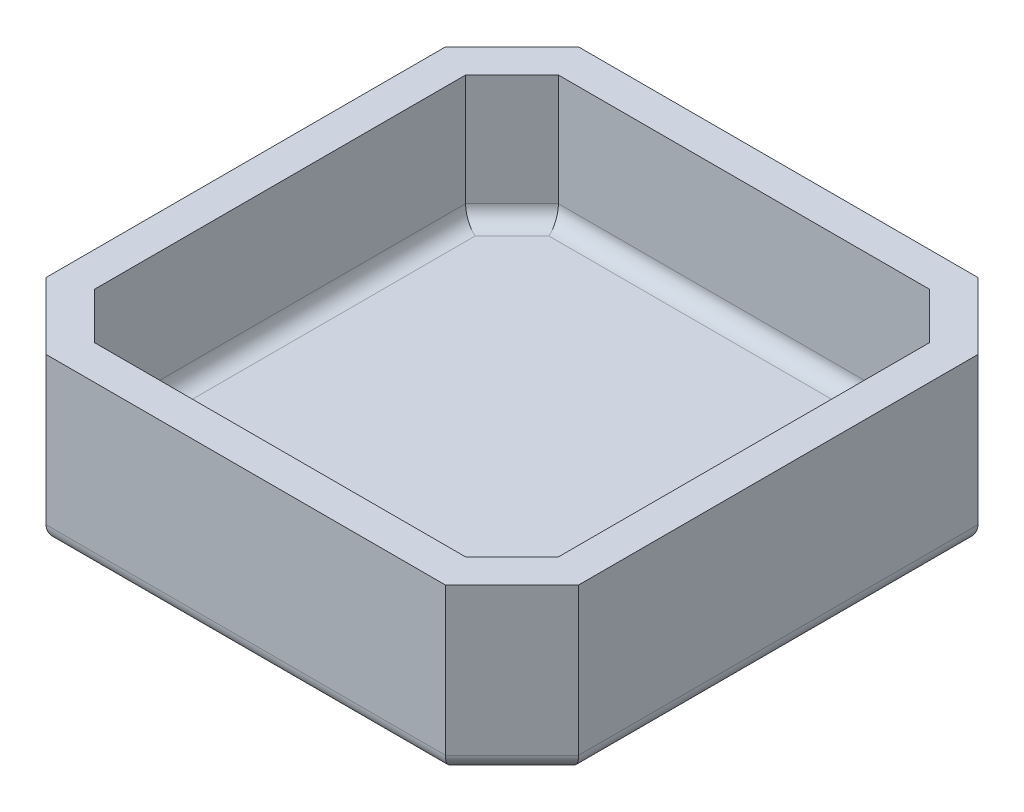
ISO-10303-21;
HEADER;
FILE_DESCRIPTION(('STEP AP214'),'2;1');
FILE_NAME('part.step','',(''),(''),'','','');
FILE_SCHEMA(('AUTOMOTIVE_DESIGN { 1 0 10303 214 1 1 1 1 }'));
ENDSEC;
DATA;
#1=APPLICATION_CONTEXT('core data for automotive mechanical design processes');
#2=APPLICATION_PROTOCOL_DEFINITION('international standard','automotive_design',2000,#1);
#3=PRODUCT_CONTEXT('',#1,'mechanical');
#4=PRODUCT('Part','Part','',(#3));
#5=PRODUCT_RELATED_PRODUCT_CATEGORY('part','',(#4));
#6=PRODUCT_DEFINITION_FORMATION('','',#4);
#7=PRODUCT_DEFINITION_CONTEXT('part definition',#1,'design');
#8=PRODUCT_DEFINITION('design','',#6,#7);
#9=PRODUCT_DEFINITION_SHAPE('','',#8);
#10=(LENGTH_UNIT() NAMED_UNIT(*) SI_UNIT(.MILLI.,.METRE.));
#11=(NAMED_UNIT(*) PLANE_ANGLE_UNIT() SI_UNIT($,.RADIAN.));
#12=(NAMED_UNIT(*) SI_UNIT($,.STERADIAN.) SOLID_ANGLE_UNIT());
#13=UNCERTAINTY_MEASURE_WITH_UNIT(LENGTH_MEASURE(1.E-05),#10,'distance_accuracy_value','');
#14=(GEOMETRIC_REPRESENTATION_CONTEXT(3) GLOBAL_UNCERTAINTY_ASSIGNED_CONTEXT((#13)) GLOBAL_UNIT_ASSIGNED_CONTEXT((#10,
#11,#12)) REPRESENTATION_CONTEXT('',''));
#15=CARTESIAN_POINT('',(0.,0.,0.));
#16=DIRECTION('',(0.,0.,1.));
#17=DIRECTION('',(1.,0.,0.));
#18=AXIS2_PLACEMENT_3D('',#15,#16,#17);
#19=CARTESIAN_POINT('',(32.5,4.4,32.5));
#20=DIRECTION('',(-1.,0.,0.));
#21=DIRECTION('',(0.,0.,1.));
#22=AXIS2_PLACEMENT_3D('',#19,#20,#21);
#23=PLANE('',#22);
#24=DIRECTION('',(0.,-1.,0.));
#25=VECTOR('',#24,1.);
#26=CARTESIAN_POINT('',(32.5,4.4,24.375));
#27=LINE('',#26,#25);
#28=CARTESIAN_POINT('',(32.5,20.,24.375));
#29=VERTEX_POINT('',#28);
#30=CARTESIAN_POINT('',(32.5,2.,24.375));
#31=VERTEX_POINT('',#30);
#32=EDGE_CURVE('E292',#29,#31,#27,.T.);
#33=ORIENTED_EDGE('',*,*,#32,.T.);
#34=DIRECTION('',(0.,0.,-1.));
#35=VECTOR('',#34,1.);
#36=CARTESIAN_POINT('',(32.5,2.,-24.375));
#37=LINE('',#36,#35);
#38=CARTESIAN_POINT('',(32.5,2.,-24.375));
#39=VERTEX_POINT('',#38);
#40=EDGE_CURVE('E360',#31,#39,#37,.T.);
#41=ORIENTED_EDGE('',*,*,#40,.T.);
#42=DIRECTION('',(0.,1.,0.));
#43=VECTOR('',#42,1.);
#44=CARTESIAN_POINT('',(32.5,4.4,-24.375));
#45=LINE('',#44,#43);
#46=CARTESIAN_POINT('',(32.5,20.,-24.375));
#47=VERTEX_POINT('',#46);
#48=EDGE_CURVE('E295',#39,#47,#45,.T.);
#49=ORIENTED_EDGE('',*,*,#48,.T.);
#50=DIRECTION('',(0.,0.,-1.));
#51=VECTOR('',#50,1.);
#52=CARTESIAN_POINT('',(32.5,20.,0.));
#53=LINE('',#52,#51);
#54=EDGE_CURVE('E263',#29,#47,#53,.T.);
#55=ORIENTED_EDGE('',*,*,#54,.F.);
#56=EDGE_LOOP('',(#33,#41,#49,#55));
#57=FACE_BOUND('',#56,.T.);
#58=ADVANCED_FACE('F35',(#57),#23,.F.);
#59=CARTESIAN_POINT('',(-32.5,4.4,-32.5));
#60=DIRECTION('',(0.,0.,1.));
#61=DIRECTION('',(1.,0.,0.));
#62=AXIS2_PLACEMENT_3D('',#59,#60,#61);
#63=PLANE('',#62);
#64=DIRECTION('',(0.,-1.,0.));
#65=VECTOR('',#64,1.);
#66=CARTESIAN_POINT('',(24.375,4.4,-32.5));
#67=LINE('',#66,#65);
#68=CARTESIAN_POINT('',(24.375,20.,-32.5));
#69=VERTEX_POINT('',#68);
#70=CARTESIAN_POINT('',(24.375,2.,-32.5));
#71=VERTEX_POINT('',#70);
#72=EDGE_CURVE('E288',#69,#71,#67,.T.);
#73=ORIENTED_EDGE('',*,*,#72,.T.);
#74=DIRECTION('',(-1.,0.,0.));
#75=VECTOR('',#74,1.);
#76=CARTESIAN_POINT('',(-24.375,2.,-32.5));
#77=LINE('',#76,#75);
#78=CARTESIAN_POINT('',(-24.375,2.,-32.5));
#79=VERTEX_POINT('',#78);
#80=EDGE_CURVE('E44',#71,#79,#77,.T.);
#81=ORIENTED_EDGE('',*,*,#80,.T.);
#82=DIRECTION('',(0.,1.,0.));
#83=VECTOR('',#82,1.);
#84=CARTESIAN_POINT('',(-24.375,4.4,-32.5));
#85=LINE('',#84,#83);
#86=CARTESIAN_POINT('',(-24.375,20.,-32.5));
#87=VERTEX_POINT('',#86);
#88=EDGE_CURVE('E290',#79,#87,#85,.T.);
#89=ORIENTED_EDGE('',*,*,#88,.T.);
#90=DIRECTION('',(-1.,0.,0.));
#91=VECTOR('',#90,1.);
#92=CARTESIAN_POINT('',(0.,20.,-32.5));
#93=LINE('',#92,#91);
#94=EDGE_CURVE('E245',#69,#87,#93,.T.);
#95=ORIENTED_EDGE('',*,*,#94,.F.);
#96=EDGE_LOOP('',(#73,#81,#89,#95));
#97=FACE_BOUND('',#96,.T.);
#98=ADVANCED_FACE('F463',(#97),#63,.F.);
#99=CARTESIAN_POINT('',(-32.5,4.4,32.5));
#100=DIRECTION('',(1.,0.,0.));
#101=DIRECTION('',(0.,0.,-1.));
#102=AXIS2_PLACEMENT_3D('',#99,#100,#101);
#103=PLANE('',#102);
#104=DIRECTION('',(0.,-1.,0.));
#105=VECTOR('',#104,1.);
#106=CARTESIAN_POINT('',(-32.5,4.4,-24.375));
#107=LINE('',#106,#105);
#108=CARTESIAN_POINT('',(-32.5,20.,-24.375));
#109=VERTEX_POINT('',#108);
#110=CARTESIAN_POINT('',(-32.5,2.,-24.375));
#111=VERTEX_POINT('',#110);
#112=EDGE_CURVE('E285',#109,#111,#107,.T.);
#113=ORIENTED_EDGE('',*,*,#112,.T.);
#114=DIRECTION('',(0.,0.,1.));
#115=VECTOR('',#114,1.);
#116=CARTESIAN_POINT('',(-32.5,2.,24.375));
#117=LINE('',#116,#115);
#118=CARTESIAN_POINT('',(-32.5,2.,24.375));
#119=VERTEX_POINT('',#118);
#120=EDGE_CURVE('E334',#111,#119,#117,.T.);
#121=ORIENTED_EDGE('',*,*,#120,.T.);
#122=DIRECTION('',(0.,1.,0.));
#123=VECTOR('',#122,1.);
#124=CARTESIAN_POINT('',(-32.5,4.4,24.375));
#125=LINE('',#124,#123);
#126=CARTESIAN_POINT('',(-32.5,20.,24.375));
#127=VERTEX_POINT('',#126);
#128=EDGE_CURVE('E208',#119,#127,#125,.T.);
#129=ORIENTED_EDGE('',*,*,#128,.T.);
#130=DIRECTION('',(0.,0.,1.));
#131=VECTOR('',#130,1.);
#132=CARTESIAN_POINT('',(-32.5,20.,0.));
#133=LINE('',#132,#131);
#134=EDGE_CURVE('E251',#109,#127,#133,.T.);
#135=ORIENTED_EDGE('',*,*,#134,.F.);
#136=EDGE_LOOP('',(#113,#121,#129,#135));
#137=FACE_BOUND('',#136,.T.);
#138=ADVANCED_FACE('F433',(#137),#103,.F.);
#139=CARTESIAN_POINT('',(-32.5,4.4,32.5));
#140=DIRECTION('',(0.,0.,-1.));
#141=DIRECTION('',(-1.,0.,0.));
#142=AXIS2_PLACEMENT_3D('',#139,#140,#141);
#143=PLANE('',#142);
#144=DIRECTION('',(0.,-1.,0.));
#145=VECTOR('',#144,1.);
#146=CARTESIAN_POINT('',(-24.375,4.4,32.5));
#147=LINE('',#146,#145);
#148=CARTESIAN_POINT('',(-24.375,20.,32.5));
#149=VERTEX_POINT('',#148);
#150=CARTESIAN_POINT('',(-24.375,2.,32.5));
#151=VERTEX_POINT('',#150);
#152=EDGE_CURVE('E297',#149,#151,#147,.T.);
#153=ORIENTED_EDGE('',*,*,#152,.T.);
#154=DIRECTION('',(1.,0.,0.));
#155=VECTOR('',#154,1.);
#156=CARTESIAN_POINT('',(24.375,2.,32.5));
#157=LINE('',#156,#155);
#158=CARTESIAN_POINT('',(24.375,2.,32.5));
#159=VERTEX_POINT('',#158);
#160=EDGE_CURVE('E356',#151,#159,#157,.T.);
#161=ORIENTED_EDGE('',*,*,#160,.T.);
#162=DIRECTION('',(0.,1.,0.));
#163=VECTOR('',#162,1.);
#164=CARTESIAN_POINT('',(24.375,4.4,32.5));
#165=LINE('',#164,#163);
#166=CARTESIAN_POINT('',(24.375,20.,32.5));
#167=VERTEX_POINT('',#166);
#168=EDGE_CURVE('E300',#159,#167,#165,.T.);
#169=ORIENTED_EDGE('',*,*,#168,.T.);
#170=DIRECTION('',(1.,0.,0.));
#171=VECTOR('',#170,1.);
#172=CARTESIAN_POINT('',(0.,20.,32.5));
#173=LINE('',#172,#171);
#174=EDGE_CURVE('E257',#149,#167,#173,.T.);
#175=ORIENTED_EDGE('',*,*,#174,.F.);
#176=EDGE_LOOP('',(#153,#161,#169,#175));
#177=FACE_BOUND('',#176,.T.);
#178=ADVANCED_FACE('F442',(#177),#143,.F.);
#179=CARTESIAN_POINT('',(0.,0.,0.));
#180=DIRECTION('',(0.,-1.,0.));
#181=DIRECTION('',(0.,0.,-1.));
#182=AXIS2_PLACEMENT_3D('',#179,#180,#181);
#183=PLANE('',#182);
#184=DIRECTION('',(0.707106781186546,0.,0.707106781186549));
#185=VECTOR('',#184,1.);
#186=CARTESIAN_POINT('',(-27.0232864376269,0.,27.0232864376269));
#187=LINE('',#186,#185);
#188=CARTESIAN_POINT('',(-23.5465728752538,0.,30.5));
#189=VERTEX_POINT('',#188);
#190=CARTESIAN_POINT('',(-30.5,0.,23.5465728752538));
#191=VERTEX_POINT('',#190);
#192=EDGE_CURVE('E349',#189,#191,#187,.F.);
#193=ORIENTED_EDGE('',*,*,#192,.T.);
#194=DIRECTION('',(0.,0.,1.));
#195=VECTOR('',#194,1.);
#196=CARTESIAN_POINT('',(-30.5,0.,-24.375));
#197=LINE('',#196,#195);
#198=CARTESIAN_POINT('',(-30.5,0.,-23.5465728752538));
#199=VERTEX_POINT('',#198);
#200=EDGE_CURVE('E351',#191,#199,#197,.F.);
#201=ORIENTED_EDGE('',*,*,#200,.T.);
#202=DIRECTION('',(-0.707106781186549,0.,0.707106781186546));
#203=VECTOR('',#202,1.);
#204=CARTESIAN_POINT('',(-27.0232864376269,0.,-27.0232864376269));
#205=LINE('',#204,#203);
#206=CARTESIAN_POINT('',(-23.5465728752538,0.,-30.5));
#207=VERTEX_POINT('',#206);
#208=EDGE_CURVE('E337',#199,#207,#205,.F.);
#209=ORIENTED_EDGE('',*,*,#208,.T.);
#210=DIRECTION('',(-1.,0.,0.));
#211=VECTOR('',#210,1.);
#212=CARTESIAN_POINT('',(24.375,0.,-30.5));
#213=LINE('',#212,#211);
#214=CARTESIAN_POINT('',(23.5465728752538,0.,-30.5));
#215=VERTEX_POINT('',#214);
#216=EDGE_CURVE('E339',#207,#215,#213,.F.);
#217=ORIENTED_EDGE('',*,*,#216,.T.);
#218=DIRECTION('',(-0.707106781186546,0.,-0.707106781186549));
#219=VECTOR('',#218,1.);
#220=CARTESIAN_POINT('',(27.0232864376269,0.,-27.0232864376269));
#221=LINE('',#220,#219);
#222=CARTESIAN_POINT('',(30.5,0.,-23.5465728752538));
#223=VERTEX_POINT('',#222);
#224=EDGE_CURVE('E341',#215,#223,#221,.F.);
#225=ORIENTED_EDGE('',*,*,#224,.T.);
#226=DIRECTION('',(0.,0.,-1.));
#227=VECTOR('',#226,1.);
#228=CARTESIAN_POINT('',(30.5,0.,24.375));
#229=LINE('',#228,#227);
#230=CARTESIAN_POINT('',(30.5,0.,23.5465728752538));
#231=VERTEX_POINT('',#230);
#232=EDGE_CURVE('E343',#223,#231,#229,.F.);
#233=ORIENTED_EDGE('',*,*,#232,.T.);
#234=DIRECTION('',(0.707106781186549,0.,-0.707106781186546));
#235=VECTOR('',#234,1.);
#236=CARTESIAN_POINT('',(27.0232864376269,0.,27.0232864376269));
#237=LINE('',#236,#235);
#238=CARTESIAN_POINT('',(23.5465728752538,0.,30.5));
#239=VERTEX_POINT('',#238);
#240=EDGE_CURVE('E345',#231,#239,#237,.F.);
#241=ORIENTED_EDGE('',*,*,#240,.T.);
#242=DIRECTION('',(1.,0.,0.));
#243=VECTOR('',#242,1.);
#244=CARTESIAN_POINT('',(-24.375,0.,30.5));
#245=LINE('',#244,#243);
#246=EDGE_CURVE('E347',#239,#189,#245,.F.);
#247=ORIENTED_EDGE('',*,*,#246,.T.);
#248=EDGE_LOOP('',(#193,#201,#209,#217,#225,#233,#241,#247));
#249=FACE_BOUND('',#248,.T.);
#250=ADVANCED_FACE('F416',(#249),#183,.T.);
#251=CARTESIAN_POINT('',(-32.5,4.4,-24.375));
#252=DIRECTION('',(0.707106781186546,0.,0.707106781186549));
#253=DIRECTION('',(0.,-1.,0.));
#254=AXIS2_PLACEMENT_3D('',#251,#252,#253);
#255=PLANE('',#254);
#256=ORIENTED_EDGE('',*,*,#88,.F.);
#257=DIRECTION('',(0.707106781186549,0.,-0.707106781186546));
#258=VECTOR('',#257,1.);
#259=CARTESIAN_POINT('',(-32.5,2.,-24.375));
#260=LINE('',#259,#258);
#261=EDGE_CURVE('E11',#79,#111,#260,.F.);
#262=ORIENTED_EDGE('',*,*,#261,.T.);
#263=ORIENTED_EDGE('',*,*,#112,.F.);
#264=DIRECTION('',(-0.707106781186549,0.,0.707106781186546));
#265=VECTOR('',#264,1.);
#266=CARTESIAN_POINT('',(-28.4375,20.,-28.4375));
#267=LINE('',#266,#265);
#268=EDGE_CURVE('E248',#87,#109,#267,.T.);
#269=ORIENTED_EDGE('',*,*,#268,.F.);
#270=EDGE_LOOP('',(#256,#262,#263,#269));
#271=FACE_BOUND('',#270,.T.);
#272=ADVANCED_FACE('F429',(#271),#255,.F.);
#273=CARTESIAN_POINT('',(24.375,4.4,-32.5));
#274=DIRECTION('',(-0.707106781186549,0.,0.707106781186546));
#275=DIRECTION('',(0.,-1.,0.));
#276=AXIS2_PLACEMENT_3D('',#273,#274,#275);
#277=PLANE('',#276);
#278=ORIENTED_EDGE('',*,*,#48,.F.);
#279=DIRECTION('',(0.707106781186546,0.,0.707106781186549));
#280=VECTOR('',#279,1.);
#281=CARTESIAN_POINT('',(24.375,2.,-32.5));
#282=LINE('',#281,#280);
#283=EDGE_CURVE('E59',#39,#71,#282,.F.);
#284=ORIENTED_EDGE('',*,*,#283,.T.);
#285=ORIENTED_EDGE('',*,*,#72,.F.);
#286=DIRECTION('',(-0.707106781186546,0.,-0.707106781186549));
#287=VECTOR('',#286,1.);
#288=CARTESIAN_POINT('',(28.4375,20.,-28.4375));
#289=LINE('',#288,#287);
#290=EDGE_CURVE('E242',#47,#69,#289,.T.);
#291=ORIENTED_EDGE('',*,*,#290,.F.);
#292=EDGE_LOOP('',(#278,#284,#285,#291));
#293=FACE_BOUND('',#292,.T.);
#294=ADVANCED_FACE('F474',(#293),#277,.F.);
#295=CARTESIAN_POINT('',(32.5,4.4,24.375));
#296=DIRECTION('',(-0.707106781186546,0.,-0.707106781186549));
#297=DIRECTION('',(0.,-1.,0.));
#298=AXIS2_PLACEMENT_3D('',#295,#296,#297);
#299=PLANE('',#298);
#300=ORIENTED_EDGE('',*,*,#168,.F.);
#301=DIRECTION('',(-0.707106781186549,0.,0.707106781186546));
#302=VECTOR('',#301,1.);
#303=CARTESIAN_POINT('',(32.5,2.,24.375));
#304=LINE('',#303,#302);
#305=EDGE_CURVE('E358',#159,#31,#304,.F.);
#306=ORIENTED_EDGE('',*,*,#305,.T.);
#307=ORIENTED_EDGE('',*,*,#32,.F.);
#308=DIRECTION('',(0.707106781186549,0.,-0.707106781186546));
#309=VECTOR('',#308,1.);
#310=CARTESIAN_POINT('',(28.4375,20.,28.4375));
#311=LINE('',#310,#309);
#312=EDGE_CURVE('E260',#167,#29,#311,.T.);
#313=ORIENTED_EDGE('',*,*,#312,.F.);
#314=EDGE_LOOP('',(#300,#306,#307,#313));
#315=FACE_BOUND('',#314,.T.);
#316=ADVANCED_FACE('F477',(#315),#299,.F.);
#317=CARTESIAN_POINT('',(-24.375,4.4,32.5));
#318=DIRECTION('',(0.707106781186549,0.,-0.707106781186546));
#319=DIRECTION('',(0.,-1.,0.));
#320=AXIS2_PLACEMENT_3D('',#317,#318,#319);
#321=PLANE('',#320);
#322=ORIENTED_EDGE('',*,*,#128,.F.);
#323=DIRECTION('',(-0.707106781186546,0.,-0.707106781186549));
#324=VECTOR('',#323,1.);
#325=CARTESIAN_POINT('',(-24.375,2.,32.5));
#326=LINE('',#325,#324);
#327=EDGE_CURVE('E354',#119,#151,#326,.F.);
#328=ORIENTED_EDGE('',*,*,#327,.T.);
#329=ORIENTED_EDGE('',*,*,#152,.F.);
#330=DIRECTION('',(0.707106781186546,0.,0.707106781186549));
#331=VECTOR('',#330,1.);
#332=CARTESIAN_POINT('',(-28.4375,20.,28.4375));
#333=LINE('',#332,#331);
#334=EDGE_CURVE('E254',#127,#149,#333,.T.);
#335=ORIENTED_EDGE('',*,*,#334,.F.);
#336=EDGE_LOOP('',(#322,#328,#329,#335));
#337=FACE_BOUND('',#336,.T.);
#338=ADVANCED_FACE('F438',(#337),#321,.F.);
#339=CARTESIAN_POINT('',(-25.4676515190165,20.,-25.4676515190165));
#340=DIRECTION('',(0.707106781186547,0.,0.707106781186547));
#341=DIRECTION('',(0.707106781186548,0.,-0.707106781186548));
#342=AXIS2_PLACEMENT_3D('',#339,#340,#341);
#343=PLANE('',#342);
#344=DIRECTION('',(0.,-1.,0.));
#345=VECTOR('',#344,1.);
#346=CARTESIAN_POINT('',(-28.3,20.,-22.635303038033));
#347=LINE('',#346,#345);
#348=CARTESIAN_POINT('',(-28.3,20.,-22.635303038033));
#349=VERTEX_POINT('',#348);
#350=CARTESIAN_POINT('',(-28.3,6.4,-22.635303038033));
#351=VERTEX_POINT('',#350);
#352=EDGE_CURVE('E266',#349,#351,#347,.T.);
#353=ORIENTED_EDGE('',*,*,#352,.T.);
#354=DIRECTION('',(-0.707106781186548,0.,0.707106781186548));
#355=VECTOR('',#354,1.);
#356=CARTESIAN_POINT('',(-25.4676515190165,6.4,-25.4676515190165));
#357=LINE('',#356,#355);
#358=CARTESIAN_POINT('',(-22.635303038033,6.4,-28.3));
#359=VERTEX_POINT('',#358);
#360=EDGE_CURVE('E205',#351,#359,#357,.F.);
#361=ORIENTED_EDGE('',*,*,#360,.T.);
#362=DIRECTION('',(0.,-1.,0.));
#363=VECTOR('',#362,1.);
#364=CARTESIAN_POINT('',(-22.635303038033,20.,-28.3));
#365=LINE('',#364,#363);
#366=CARTESIAN_POINT('',(-22.635303038033,20.,-28.3));
#367=VERTEX_POINT('',#366);
#368=EDGE_CURVE('E198',#367,#359,#365,.T.);
#369=ORIENTED_EDGE('',*,*,#368,.F.);
#370=DIRECTION('',(-0.707106781186548,0.,0.707106781186548));
#371=VECTOR('',#370,1.);
#372=CARTESIAN_POINT('',(-25.4676515190165,20.,-25.4676515190165));
#373=LINE('',#372,#371);
#374=EDGE_CURVE('E202',#367,#349,#373,.T.);
#375=ORIENTED_EDGE('',*,*,#374,.T.);
#376=EDGE_LOOP('',(#353,#361,#369,#375));
#377=FACE_BOUND('',#376,.T.);
#378=ADVANCED_FACE('F201',(#377),#343,.T.);
#379=CARTESIAN_POINT('',(0.,20.,-28.3));
#380=DIRECTION('',(0.,0.,1.));
#381=DIRECTION('',(1.,0.,0.));
#382=AXIS2_PLACEMENT_3D('',#379,#380,#381);
#383=PLANE('',#382);
#384=ORIENTED_EDGE('',*,*,#368,.T.);
#385=DIRECTION('',(-1.,0.,0.));
#386=VECTOR('',#385,1.);
#387=CARTESIAN_POINT('',(0.,6.4,-28.3));
#388=LINE('',#387,#386);
#389=CARTESIAN_POINT('',(22.635303038033,6.4,-28.3));
#390=VERTEX_POINT('',#389);
#391=EDGE_CURVE('E332',#359,#390,#388,.F.);
#392=ORIENTED_EDGE('',*,*,#391,.T.);
#393=DIRECTION('',(0.,-1.,0.));
#394=VECTOR('',#393,1.);
#395=CARTESIAN_POINT('',(22.635303038033,20.,-28.3));
#396=LINE('',#395,#394);
#397=CARTESIAN_POINT('',(22.635303038033,20.,-28.3));
#398=VERTEX_POINT('',#397);
#399=EDGE_CURVE('E209',#398,#390,#396,.T.);
#400=ORIENTED_EDGE('',*,*,#399,.F.);
#401=DIRECTION('',(-1.,0.,0.));
#402=VECTOR('',#401,1.);
#403=CARTESIAN_POINT('',(0.,20.,-28.3));
#404=LINE('',#403,#402);
#405=EDGE_CURVE('E216',#398,#367,#404,.T.);
#406=ORIENTED_EDGE('',*,*,#405,.T.);
#407=EDGE_LOOP('',(#384,#392,#400,#406));
#408=FACE_BOUND('',#407,.T.);
#409=ADVANCED_FACE('F223',(#408),#383,.T.);
#410=CARTESIAN_POINT('',(25.4676515190165,20.,-25.4676515190165));
#411=DIRECTION('',(-0.707106781186547,0.,0.707106781186548));
#412=DIRECTION('',(0.707106781186548,0.,0.707106781186547));
#413=AXIS2_PLACEMENT_3D('',#410,#411,#412);
#414=PLANE('',#413);
#415=ORIENTED_EDGE('',*,*,#399,.T.);
#416=DIRECTION('',(-0.707106781186548,0.,-0.707106781186547));
#417=VECTOR('',#416,1.);
#418=CARTESIAN_POINT('',(25.4676515190165,6.4,-25.4676515190165));
#419=LINE('',#418,#417);
#420=CARTESIAN_POINT('',(28.3,6.4,-22.635303038033));
#421=VERTEX_POINT('',#420);
#422=EDGE_CURVE('E330',#390,#421,#419,.F.);
#423=ORIENTED_EDGE('',*,*,#422,.T.);
#424=DIRECTION('',(0.,-1.,0.));
#425=VECTOR('',#424,1.);
#426=CARTESIAN_POINT('',(28.3,20.,-22.635303038033));
#427=LINE('',#426,#425);
#428=CARTESIAN_POINT('',(28.3,20.,-22.635303038033));
#429=VERTEX_POINT('',#428);
#430=EDGE_CURVE('E280',#429,#421,#427,.T.);
#431=ORIENTED_EDGE('',*,*,#430,.F.);
#432=DIRECTION('',(-0.707106781186548,0.,-0.707106781186547));
#433=VECTOR('',#432,1.);
#434=CARTESIAN_POINT('',(25.4676515190165,20.,-25.4676515190165));
#435=LINE('',#434,#433);
#436=EDGE_CURVE('E225',#429,#398,#435,.T.);
#437=ORIENTED_EDGE('',*,*,#436,.T.);
#438=EDGE_LOOP('',(#415,#423,#431,#437));
#439=FACE_BOUND('',#438,.T.);
#440=ADVANCED_FACE('F548',(#439),#414,.T.);
#441=CARTESIAN_POINT('',(28.3,20.,0.));
#442=DIRECTION('',(-1.,0.,0.));
#443=DIRECTION('',(0.,0.,1.));
#444=AXIS2_PLACEMENT_3D('',#441,#442,#443);
#445=PLANE('',#444);
#446=ORIENTED_EDGE('',*,*,#430,.T.);
#447=DIRECTION('',(0.,0.,-1.));
#448=VECTOR('',#447,1.);
#449=CARTESIAN_POINT('',(28.3,6.4,0.));
#450=LINE('',#449,#448);
#451=CARTESIAN_POINT('',(28.3,6.4,22.635303038033));
#452=VERTEX_POINT('',#451);
#453=EDGE_CURVE('E328',#421,#452,#450,.F.);
#454=ORIENTED_EDGE('',*,*,#453,.T.);
#455=DIRECTION('',(0.,-1.,0.));
#456=VECTOR('',#455,1.);
#457=CARTESIAN_POINT('',(28.3,20.,22.635303038033));
#458=LINE('',#457,#456);
#459=CARTESIAN_POINT('',(28.3,20.,22.635303038033));
#460=VERTEX_POINT('',#459);
#461=EDGE_CURVE('E277',#460,#452,#458,.T.);
#462=ORIENTED_EDGE('',*,*,#461,.F.);
#463=DIRECTION('',(0.,0.,-1.));
#464=VECTOR('',#463,1.);
#465=CARTESIAN_POINT('',(28.3,20.,0.));
#466=LINE('',#465,#464);
#467=EDGE_CURVE('E227',#460,#429,#466,.T.);
#468=ORIENTED_EDGE('',*,*,#467,.T.);
#469=EDGE_LOOP('',(#446,#454,#462,#468));
#470=FACE_BOUND('',#469,.T.);
#471=ADVANCED_FACE('F553',(#470),#445,.T.);
#472=CARTESIAN_POINT('',(25.4676515190165,20.,25.4676515190165));
#473=DIRECTION('',(-0.707106781186547,0.,-0.707106781186547));
#474=DIRECTION('',(-0.707106781186548,0.,0.707106781186548));
#475=AXIS2_PLACEMENT_3D('',#472,#473,#474);
#476=PLANE('',#475);
#477=ORIENTED_EDGE('',*,*,#461,.T.);
#478=DIRECTION('',(0.707106781186548,0.,-0.707106781186548));
#479=VECTOR('',#478,1.);
#480=CARTESIAN_POINT('',(25.4676515190165,6.4,25.4676515190165));
#481=LINE('',#480,#479);
#482=CARTESIAN_POINT('',(22.635303038033,6.4,28.3));
#483=VERTEX_POINT('',#482);
#484=EDGE_CURVE('E326',#452,#483,#481,.F.);
#485=ORIENTED_EDGE('',*,*,#484,.T.);
#486=DIRECTION('',(0.,-1.,0.));
#487=VECTOR('',#486,1.);
#488=CARTESIAN_POINT('',(22.635303038033,20.,28.3));
#489=LINE('',#488,#487);
#490=CARTESIAN_POINT('',(22.635303038033,20.,28.3));
#491=VERTEX_POINT('',#490);
#492=EDGE_CURVE('E274',#491,#483,#489,.T.);
#493=ORIENTED_EDGE('',*,*,#492,.F.);
#494=DIRECTION('',(0.707106781186548,0.,-0.707106781186548));
#495=VECTOR('',#494,1.);
#496=CARTESIAN_POINT('',(25.4676515190165,20.,25.4676515190165));
#497=LINE('',#496,#495);
#498=EDGE_CURVE('E232',#491,#460,#497,.T.);
#499=ORIENTED_EDGE('',*,*,#498,.T.);
#500=EDGE_LOOP('',(#477,#485,#493,#499));
#501=FACE_BOUND('',#500,.T.);
#502=ADVANCED_FACE('F556',(#501),#476,.T.);
#503=CARTESIAN_POINT('',(0.,20.,28.3));
#504=DIRECTION('',(0.,0.,-1.));
#505=DIRECTION('',(-1.,0.,0.));
#506=AXIS2_PLACEMENT_3D('',#503,#504,#505);
#507=PLANE('',#506);
#508=ORIENTED_EDGE('',*,*,#492,.T.);
#509=DIRECTION('',(1.,0.,0.));
#510=VECTOR('',#509,1.);
#511=CARTESIAN_POINT('',(0.,6.4,28.3));
#512=LINE('',#511,#510);
#513=CARTESIAN_POINT('',(-22.635303038033,6.4,28.3));
#514=VERTEX_POINT('',#513);
#515=EDGE_CURVE('E324',#483,#514,#512,.F.);
#516=ORIENTED_EDGE('',*,*,#515,.T.);
#517=DIRECTION('',(0.,-1.,0.));
#518=VECTOR('',#517,1.);
#519=CARTESIAN_POINT('',(-22.635303038033,20.,28.3));
#520=LINE('',#519,#518);
#521=CARTESIAN_POINT('',(-22.635303038033,20.,28.3));
#522=VERTEX_POINT('',#521);
#523=EDGE_CURVE('E271',#522,#514,#520,.T.);
#524=ORIENTED_EDGE('',*,*,#523,.F.);
#525=DIRECTION('',(1.,0.,0.));
#526=VECTOR('',#525,1.);
#527=CARTESIAN_POINT('',(0.,20.,28.3));
#528=LINE('',#527,#526);
#529=EDGE_CURVE('E235',#522,#491,#528,.T.);
#530=ORIENTED_EDGE('',*,*,#529,.T.);
#531=EDGE_LOOP('',(#508,#516,#524,#530));
#532=FACE_BOUND('',#531,.T.);
#533=ADVANCED_FACE('F528',(#532),#507,.T.);
#534=CARTESIAN_POINT('',(-25.4676515190165,20.,25.4676515190165));
#535=DIRECTION('',(0.707106781186547,0.,-0.707106781186547));
#536=DIRECTION('',(-0.707106781186548,0.,-0.707106781186548));
#537=AXIS2_PLACEMENT_3D('',#534,#535,#536);
#538=PLANE('',#537);
#539=ORIENTED_EDGE('',*,*,#523,.T.);
#540=DIRECTION('',(0.707106781186548,0.,0.707106781186548));
#541=VECTOR('',#540,1.);
#542=CARTESIAN_POINT('',(-25.4676515190165,6.4,25.4676515190165));
#543=LINE('',#542,#541);
#544=CARTESIAN_POINT('',(-28.3,6.4,22.635303038033));
#545=VERTEX_POINT('',#544);
#546=EDGE_CURVE('E322',#514,#545,#543,.F.);
#547=ORIENTED_EDGE('',*,*,#546,.T.);
#548=DIRECTION('',(0.,-1.,0.));
#549=VECTOR('',#548,1.);
#550=CARTESIAN_POINT('',(-28.3,20.,22.635303038033));
#551=LINE('',#550,#549);
#552=CARTESIAN_POINT('',(-28.3,20.,22.635303038033));
#553=VERTEX_POINT('',#552);
#554=EDGE_CURVE('E268',#553,#545,#551,.T.);
#555=ORIENTED_EDGE('',*,*,#554,.F.);
#556=DIRECTION('',(0.707106781186548,0.,0.707106781186548));
#557=VECTOR('',#556,1.);
#558=CARTESIAN_POINT('',(-25.4676515190165,20.,25.4676515190165));
#559=LINE('',#558,#557);
#560=EDGE_CURVE('E238',#553,#522,#559,.T.);
#561=ORIENTED_EDGE('',*,*,#560,.T.);
#562=EDGE_LOOP('',(#539,#547,#555,#561));
#563=FACE_BOUND('',#562,.T.);
#564=ADVANCED_FACE('F531',(#563),#538,.T.);
#565=CARTESIAN_POINT('',(-28.3,20.,0.));
#566=DIRECTION('',(1.,0.,0.));
#567=DIRECTION('',(0.,0.,-1.));
#568=AXIS2_PLACEMENT_3D('',#565,#566,#567);
#569=PLANE('',#568);
#570=ORIENTED_EDGE('',*,*,#554,.T.);
#571=DIRECTION('',(0.,0.,1.));
#572=VECTOR('',#571,1.);
#573=CARTESIAN_POINT('',(-28.3,6.4,0.));
#574=LINE('',#573,#572);
#575=EDGE_CURVE('E320',#545,#351,#574,.F.);
#576=ORIENTED_EDGE('',*,*,#575,.T.);
#577=ORIENTED_EDGE('',*,*,#352,.F.);
#578=DIRECTION('',(0.,0.,1.));
#579=VECTOR('',#578,1.);
#580=CARTESIAN_POINT('',(-28.3,20.,0.));
#581=LINE('',#580,#579);
#582=EDGE_CURVE('E220',#349,#553,#581,.T.);
#583=ORIENTED_EDGE('',*,*,#582,.T.);
#584=EDGE_LOOP('',(#570,#576,#577,#583));
#585=FACE_BOUND('',#584,.T.);
#586=ADVANCED_FACE('F534',(#585),#569,.T.);
#587=CARTESIAN_POINT('',(0.,20.,0.));
#588=DIRECTION('',(0.,1.,0.));
#589=DIRECTION('',(0.,0.,1.));
#590=AXIS2_PLACEMENT_3D('',#587,#588,#589);
#591=PLANE('',#590);
#592=ORIENTED_EDGE('',*,*,#374,.F.);
#593=ORIENTED_EDGE('',*,*,#405,.F.);
#594=ORIENTED_EDGE('',*,*,#436,.F.);
#595=ORIENTED_EDGE('',*,*,#467,.F.);
#596=ORIENTED_EDGE('',*,*,#498,.F.);
#597=ORIENTED_EDGE('',*,*,#529,.F.);
#598=ORIENTED_EDGE('',*,*,#560,.F.);
#599=ORIENTED_EDGE('',*,*,#582,.F.);
#600=EDGE_LOOP('',(#592,#593,#594,#595,#596,#597,#598,#599));
#601=FACE_BOUND('',#600,.T.);
#602=ORIENTED_EDGE('',*,*,#290,.T.);
#603=ORIENTED_EDGE('',*,*,#94,.T.);
#604=ORIENTED_EDGE('',*,*,#268,.T.);
#605=ORIENTED_EDGE('',*,*,#134,.T.);
#606=ORIENTED_EDGE('',*,*,#334,.T.);
#607=ORIENTED_EDGE('',*,*,#174,.T.);
#608=ORIENTED_EDGE('',*,*,#312,.T.);
#609=ORIENTED_EDGE('',*,*,#54,.T.);
#610=EDGE_LOOP('',(#602,#603,#604,#605,#606,#607,#608,#609));
#611=FACE_BOUND('',#610,.T.);
#612=ADVANCED_FACE('F213',(#601,#611),#591,.T.);
#613=CARTESIAN_POINT('',(0.,4.4,0.));
#614=DIRECTION('',(0.,-1.,0.));
#615=DIRECTION('',(0.,0.,-1.));
#616=AXIS2_PLACEMENT_3D('',#613,#614,#615);
#617=PLANE('',#616);
#618=DIRECTION('',(-1.,0.,0.));
#619=VECTOR('',#618,1.);
#620=CARTESIAN_POINT('',(0.,4.4,-26.3));
#621=LINE('',#620,#619);
#622=CARTESIAN_POINT('',(21.8068759132868,4.4,-26.3));
#623=VERTEX_POINT('',#622);
#624=CARTESIAN_POINT('',(-21.8068759132868,4.4,-26.3));
#625=VERTEX_POINT('',#624);
#626=EDGE_CURVE('E302',#623,#625,#621,.T.);
#627=ORIENTED_EDGE('',*,*,#626,.T.);
#628=DIRECTION('',(-0.707106781186548,0.,0.707106781186548));
#629=VECTOR('',#628,1.);
#630=CARTESIAN_POINT('',(-24.0534379566434,4.4,-24.0534379566434));
#631=LINE('',#630,#629);
#632=CARTESIAN_POINT('',(-26.3,4.4,-21.8068759132868));
#633=VERTEX_POINT('',#632);
#634=EDGE_CURVE('E316',#625,#633,#631,.T.);
#635=ORIENTED_EDGE('',*,*,#634,.T.);
#636=DIRECTION('',(0.,0.,1.));
#637=VECTOR('',#636,1.);
#638=CARTESIAN_POINT('',(-26.3,4.4,0.));
#639=LINE('',#638,#637);
#640=CARTESIAN_POINT('',(-26.3,4.4,21.8068759132868));
#641=VERTEX_POINT('',#640);
#642=EDGE_CURVE('E314',#633,#641,#639,.T.);
#643=ORIENTED_EDGE('',*,*,#642,.T.);
#644=DIRECTION('',(0.707106781186548,0.,0.707106781186548));
#645=VECTOR('',#644,1.);
#646=CARTESIAN_POINT('',(-24.0534379566434,4.4,24.0534379566434));
#647=LINE('',#646,#645);
#648=CARTESIAN_POINT('',(-21.8068759132868,4.4,26.3));
#649=VERTEX_POINT('',#648);
#650=EDGE_CURVE('E312',#641,#649,#647,.T.);
#651=ORIENTED_EDGE('',*,*,#650,.T.);
#652=DIRECTION('',(1.,0.,0.));
#653=VECTOR('',#652,1.);
#654=CARTESIAN_POINT('',(0.,4.4,26.3));
#655=LINE('',#654,#653);
#656=CARTESIAN_POINT('',(21.8068759132868,4.4,26.3));
#657=VERTEX_POINT('',#656);
#658=EDGE_CURVE('E310',#649,#657,#655,.T.);
#659=ORIENTED_EDGE('',*,*,#658,.T.);
#660=DIRECTION('',(0.707106781186548,0.,-0.707106781186548));
#661=VECTOR('',#660,1.);
#662=CARTESIAN_POINT('',(24.0534379566434,4.4,24.0534379566434));
#663=LINE('',#662,#661);
#664=CARTESIAN_POINT('',(26.3,4.4,21.8068759132868));
#665=VERTEX_POINT('',#664);
#666=EDGE_CURVE('E308',#657,#665,#663,.T.);
#667=ORIENTED_EDGE('',*,*,#666,.T.);
#668=DIRECTION('',(0.,0.,-1.));
#669=VECTOR('',#668,1.);
#670=CARTESIAN_POINT('',(26.3,4.4,0.));
#671=LINE('',#670,#669);
#672=CARTESIAN_POINT('',(26.3,4.4,-21.8068759132868));
#673=VERTEX_POINT('',#672);
#674=EDGE_CURVE('E306',#665,#673,#671,.T.);
#675=ORIENTED_EDGE('',*,*,#674,.T.);
#676=DIRECTION('',(-0.707106781186548,0.,-0.707106781186547));
#677=VECTOR('',#676,1.);
#678=CARTESIAN_POINT('',(24.0534379566434,4.4,-24.0534379566434));
#679=LINE('',#678,#677);
#680=EDGE_CURVE('E304',#673,#623,#679,.T.);
#681=ORIENTED_EDGE('',*,*,#680,.T.);
#682=EDGE_LOOP('',(#627,#635,#643,#651,#659,#667,#675,#681));
#683=FACE_BOUND('',#682,.T.);
#684=ADVANCED_FACE('F512',(#683),#617,.F.);
#685=CARTESIAN_POINT('',(24.0534379566434,6.4,24.0534379566434));
#686=DIRECTION('',(0.707106781186548,0.,-0.707106781186548));
#687=DIRECTION('',(-0.707106781186548,0.,-0.707106781186548));
#688=AXIS2_PLACEMENT_3D('',#685,#686,#687);
#689=CYLINDRICAL_SURFACE('',#688,2.);
#690=CARTESIAN_POINT('',(21.8068759132868,6.4,26.3));
#691=DIRECTION('',(0.923879532511287,0.,-0.38268343236509));
#692=DIRECTION('',(0.38268343236509,0.,0.923879532511287));
#693=AXIS2_PLACEMENT_3D('',#690,#691,#692);
#694=ELLIPSE('',#693,2.16478440058479,2.);
#695=EDGE_CURVE('E380',#483,#657,#694,.T.);
#696=ORIENTED_EDGE('',*,*,#695,.F.);
#697=ORIENTED_EDGE('',*,*,#484,.F.);
#698=CARTESIAN_POINT('',(26.3,6.4,21.8068759132868));
#699=DIRECTION('',(0.38268343236509,0.,-0.923879532511287));
#700=DIRECTION('',(0.923879532511287,0.,0.38268343236509));
#701=AXIS2_PLACEMENT_3D('',#698,#699,#700);
#702=ELLIPSE('',#701,2.16478440058479,2.);
#703=EDGE_CURVE('E221',#665,#452,#702,.F.);
#704=ORIENTED_EDGE('',*,*,#703,.F.);
#705=ORIENTED_EDGE('',*,*,#666,.F.);
#706=EDGE_LOOP('',(#696,#697,#704,#705));
#707=FACE_BOUND('',#706,.T.);
#708=ADVANCED_FACE('F509',(#707),#689,.F.);
#709=CARTESIAN_POINT('',(26.3,6.4,0.));
#710=DIRECTION('',(0.,0.,-1.));
#711=DIRECTION('',(-1.,0.,0.));
#712=AXIS2_PLACEMENT_3D('',#709,#710,#711);
#713=CYLINDRICAL_SURFACE('',#712,2.);
#714=ORIENTED_EDGE('',*,*,#703,.T.);
#715=ORIENTED_EDGE('',*,*,#453,.F.);
#716=CARTESIAN_POINT('',(26.3,6.4,-21.8068759132868));
#717=DIRECTION('',(-0.38268343236509,0.,-0.923879532511287));
#718=DIRECTION('',(0.923879532511287,0.,-0.38268343236509));
#719=AXIS2_PLACEMENT_3D('',#716,#717,#718);
#720=ELLIPSE('',#719,2.16478440058479,2.);
#721=EDGE_CURVE('E377',#673,#421,#720,.F.);
#722=ORIENTED_EDGE('',*,*,#721,.F.);
#723=ORIENTED_EDGE('',*,*,#674,.F.);
#724=EDGE_LOOP('',(#714,#715,#722,#723));
#725=FACE_BOUND('',#724,.T.);
#726=ADVANCED_FACE('F506',(#725),#713,.F.);
#727=CARTESIAN_POINT('',(0.,6.4,26.3));
#728=DIRECTION('',(1.,0.,0.));
#729=DIRECTION('',(0.,0.,-1.));
#730=AXIS2_PLACEMENT_3D('',#727,#728,#729);
#731=CYLINDRICAL_SURFACE('',#730,2.);
#732=ORIENTED_EDGE('',*,*,#695,.T.);
#733=ORIENTED_EDGE('',*,*,#658,.F.);
#734=CARTESIAN_POINT('',(-21.8068759132868,6.4,26.3));
#735=DIRECTION('',(0.923879532511287,0.,0.38268343236509));
#736=DIRECTION('',(-0.38268343236509,0.,0.923879532511287));
#737=AXIS2_PLACEMENT_3D('',#734,#735,#736);
#738=ELLIPSE('',#737,2.16478440058479,2.);
#739=EDGE_CURVE('E374',#514,#649,#738,.T.);
#740=ORIENTED_EDGE('',*,*,#739,.F.);
#741=ORIENTED_EDGE('',*,*,#515,.F.);
#742=EDGE_LOOP('',(#732,#733,#740,#741));
#743=FACE_BOUND('',#742,.T.);
#744=ADVANCED_FACE('F502',(#743),#731,.F.);
#745=CARTESIAN_POINT('',(24.0534379566434,6.4,-24.0534379566434));
#746=DIRECTION('',(-0.707106781186548,0.,-0.707106781186547));
#747=DIRECTION('',(-0.707106781186547,0.,0.707106781186548));
#748=AXIS2_PLACEMENT_3D('',#745,#746,#747);
#749=CYLINDRICAL_SURFACE('',#748,2.);
#750=ORIENTED_EDGE('',*,*,#721,.T.);
#751=ORIENTED_EDGE('',*,*,#422,.F.);
#752=CARTESIAN_POINT('',(21.8068759132868,6.4,-26.3));
#753=DIRECTION('',(-0.923879532511287,0.,-0.38268343236509));
#754=DIRECTION('',(0.38268343236509,0.,-0.923879532511287));
#755=AXIS2_PLACEMENT_3D('',#752,#753,#754);
#756=ELLIPSE('',#755,2.16478440058479,2.);
#757=EDGE_CURVE('E371',#623,#390,#756,.F.);
#758=ORIENTED_EDGE('',*,*,#757,.F.);
#759=ORIENTED_EDGE('',*,*,#680,.F.);
#760=EDGE_LOOP('',(#750,#751,#758,#759));
#761=FACE_BOUND('',#760,.T.);
#762=ADVANCED_FACE('F498',(#761),#749,.F.);
#763=CARTESIAN_POINT('',(-24.0534379566434,6.4,24.0534379566434));
#764=DIRECTION('',(0.707106781186548,0.,0.707106781186548));
#765=DIRECTION('',(0.707106781186548,0.,-0.707106781186548));
#766=AXIS2_PLACEMENT_3D('',#763,#764,#765);
#767=CYLINDRICAL_SURFACE('',#766,2.);
#768=ORIENTED_EDGE('',*,*,#739,.T.);
#769=ORIENTED_EDGE('',*,*,#650,.F.);
#770=CARTESIAN_POINT('',(-26.3,6.4,21.8068759132868));
#771=DIRECTION('',(0.38268343236509,0.,0.923879532511287));
#772=DIRECTION('',(-0.923879532511287,0.,0.38268343236509));
#773=AXIS2_PLACEMENT_3D('',#770,#771,#772);
#774=ELLIPSE('',#773,2.16478440058479,2.);
#775=EDGE_CURVE('E368',#545,#641,#774,.T.);
#776=ORIENTED_EDGE('',*,*,#775,.F.);
#777=ORIENTED_EDGE('',*,*,#546,.F.);
#778=EDGE_LOOP('',(#768,#769,#776,#777));
#779=FACE_BOUND('',#778,.T.);
#780=ADVANCED_FACE('F494',(#779),#767,.F.);
#781=CARTESIAN_POINT('',(0.,6.4,-26.3));
#782=DIRECTION('',(-1.,0.,0.));
#783=DIRECTION('',(0.,0.,1.));
#784=AXIS2_PLACEMENT_3D('',#781,#782,#783);
#785=CYLINDRICAL_SURFACE('',#784,2.);
#786=ORIENTED_EDGE('',*,*,#757,.T.);
#787=ORIENTED_EDGE('',*,*,#391,.F.);
#788=CARTESIAN_POINT('',(-21.8068759132868,6.4,-26.3));
#789=DIRECTION('',(-0.923879532511287,0.,0.38268343236509));
#790=DIRECTION('',(0.38268343236509,0.,0.923879532511287));
#791=AXIS2_PLACEMENT_3D('',#788,#789,#790);
#792=ELLIPSE('',#791,2.16478440058479,2.);
#793=EDGE_CURVE('E366',#625,#359,#792,.F.);
#794=ORIENTED_EDGE('',*,*,#793,.F.);
#795=ORIENTED_EDGE('',*,*,#626,.F.);
#796=EDGE_LOOP('',(#786,#787,#794,#795));
#797=FACE_BOUND('',#796,.T.);
#798=ADVANCED_FACE('F490',(#797),#785,.F.);
#799=CARTESIAN_POINT('',(-26.3,6.4,0.));
#800=DIRECTION('',(0.,0.,1.));
#801=DIRECTION('',(1.,0.,0.));
#802=AXIS2_PLACEMENT_3D('',#799,#800,#801);
#803=CYLINDRICAL_SURFACE('',#802,2.);
#804=ORIENTED_EDGE('',*,*,#775,.T.);
#805=ORIENTED_EDGE('',*,*,#642,.F.);
#806=CARTESIAN_POINT('',(-26.3,6.4,-21.8068759132868));
#807=DIRECTION('',(-0.38268343236509,0.,0.923879532511287));
#808=DIRECTION('',(-0.923879532511287,0.,-0.38268343236509));
#809=AXIS2_PLACEMENT_3D('',#806,#807,#808);
#810=ELLIPSE('',#809,2.16478440058479,2.);
#811=EDGE_CURVE('E364',#351,#633,#810,.T.);
#812=ORIENTED_EDGE('',*,*,#811,.F.);
#813=ORIENTED_EDGE('',*,*,#575,.F.);
#814=EDGE_LOOP('',(#804,#805,#812,#813));
#815=FACE_BOUND('',#814,.T.);
#816=ADVANCED_FACE('F486',(#815),#803,.F.);
#817=CARTESIAN_POINT('',(-24.0534379566434,6.4,-24.0534379566434));
#818=DIRECTION('',(-0.707106781186548,0.,0.707106781186548));
#819=DIRECTION('',(0.707106781186548,0.,0.707106781186548));
#820=AXIS2_PLACEMENT_3D('',#817,#818,#819);
#821=CYLINDRICAL_SURFACE('',#820,2.);
#822=ORIENTED_EDGE('',*,*,#793,.T.);
#823=ORIENTED_EDGE('',*,*,#360,.F.);
#824=ORIENTED_EDGE('',*,*,#811,.T.);
#825=ORIENTED_EDGE('',*,*,#634,.F.);
#826=EDGE_LOOP('',(#822,#823,#824,#825));
#827=FACE_BOUND('',#826,.T.);
#828=ADVANCED_FACE('F483',(#827),#821,.F.);
#829=CARTESIAN_POINT('',(30.5,2.,32.5));
#830=DIRECTION('',(0.,0.,1.));
#831=DIRECTION('',(1.,0.,0.));
#832=AXIS2_PLACEMENT_3D('',#829,#830,#831);
#833=CYLINDRICAL_SURFACE('',#832,2.);
#834=CARTESIAN_POINT('',(30.5,2.,23.5465728752538));
#835=DIRECTION('',(-0.382683432365091,0.,0.923879532511287));
#836=DIRECTION('',(0.923879532511287,0.,0.382683432365091));
#837=AXIS2_PLACEMENT_3D('',#834,#835,#836);
#838=ELLIPSE('',#837,2.16478440058479,2.);
#839=EDGE_CURVE('E400',#231,#31,#838,.T.);
#840=ORIENTED_EDGE('',*,*,#839,.F.);
#841=ORIENTED_EDGE('',*,*,#232,.F.);
#842=CARTESIAN_POINT('',(30.5,2.,-23.5465728752538));
#843=DIRECTION('',(-0.382683432365089,0.,-0.923879532511287));
#844=DIRECTION('',(-0.923879532511287,0.,0.382683432365089));
#845=AXIS2_PLACEMENT_3D('',#842,#843,#844);
#846=ELLIPSE('',#845,2.16478440058479,2.);
#847=EDGE_CURVE('E39',#39,#223,#846,.T.);
#848=ORIENTED_EDGE('',*,*,#847,.F.);
#849=ORIENTED_EDGE('',*,*,#40,.F.);
#850=EDGE_LOOP('',(#840,#841,#848,#849));
#851=FACE_BOUND('',#850,.T.);
#852=ADVANCED_FACE('F37',(#851),#833,.T.);
#853=CARTESIAN_POINT('',(27.0232864376269,2.,-27.0232864376268));
#854=DIRECTION('',(-0.707106781186546,0.,-0.707106781186549));
#855=DIRECTION('',(-0.707106781186549,0.,0.707106781186546));
#856=AXIS2_PLACEMENT_3D('',#853,#854,#855);
#857=CYLINDRICAL_SURFACE('',#856,2.);
#858=ORIENTED_EDGE('',*,*,#847,.T.);
#859=ORIENTED_EDGE('',*,*,#224,.F.);
#860=CARTESIAN_POINT('',(23.5465728752538,2.,-30.5));
#861=DIRECTION('',(0.923879532511287,0.,0.382683432365091));
#862=DIRECTION('',(0.382683432365091,0.,-0.923879532511287));
#863=AXIS2_PLACEMENT_3D('',#860,#861,#862);
#864=ELLIPSE('',#863,2.16478440058479,2.);
#865=EDGE_CURVE('E398',#71,#215,#864,.F.);
#866=ORIENTED_EDGE('',*,*,#865,.F.);
#867=ORIENTED_EDGE('',*,*,#283,.F.);
#868=EDGE_LOOP('',(#858,#859,#866,#867));
#869=FACE_BOUND('',#868,.T.);
#870=ADVANCED_FACE('F410',(#869),#857,.T.);
#871=CARTESIAN_POINT('',(27.0232864376268,2.,27.0232864376269));
#872=DIRECTION('',(0.707106781186549,0.,-0.707106781186546));
#873=DIRECTION('',(-0.707106781186546,0.,-0.707106781186549));
#874=AXIS2_PLACEMENT_3D('',#871,#872,#873);
#875=CYLINDRICAL_SURFACE('',#874,2.);
#876=ORIENTED_EDGE('',*,*,#839,.T.);
#877=ORIENTED_EDGE('',*,*,#305,.F.);
#878=CARTESIAN_POINT('',(23.5465728752538,2.,30.5));
#879=DIRECTION('',(0.923879532511287,0.,-0.382683432365089));
#880=DIRECTION('',(-0.382683432365089,0.,-0.923879532511287));
#881=AXIS2_PLACEMENT_3D('',#878,#879,#880);
#882=ELLIPSE('',#881,2.16478440058479,2.);
#883=EDGE_CURVE('E395',#239,#159,#882,.F.);
#884=ORIENTED_EDGE('',*,*,#883,.F.);
#885=ORIENTED_EDGE('',*,*,#240,.F.);
#886=EDGE_LOOP('',(#876,#877,#884,#885));
#887=FACE_BOUND('',#886,.T.);
#888=ADVANCED_FACE('F718',(#887),#875,.T.);
#889=CARTESIAN_POINT('',(-32.5,2.,-30.5));
#890=DIRECTION('',(1.,0.,0.));
#891=DIRECTION('',(0.,0.,-1.));
#892=AXIS2_PLACEMENT_3D('',#889,#890,#891);
#893=CYLINDRICAL_SURFACE('',#892,2.);
#894=ORIENTED_EDGE('',*,*,#865,.T.);
#895=ORIENTED_EDGE('',*,*,#216,.F.);
#896=CARTESIAN_POINT('',(-23.5465728752538,2.,-30.5));
#897=DIRECTION('',(-0.923879532511287,0.,0.382683432365089));
#898=DIRECTION('',(0.382683432365089,0.,0.923879532511287));
#899=AXIS2_PLACEMENT_3D('',#896,#897,#898);
#900=ELLIPSE('',#899,2.16478440058479,2.);
#901=EDGE_CURVE('E392',#79,#207,#900,.T.);
#902=ORIENTED_EDGE('',*,*,#901,.F.);
#903=ORIENTED_EDGE('',*,*,#80,.F.);
#904=EDGE_LOOP('',(#894,#895,#902,#903));
#905=FACE_BOUND('',#904,.T.);
#906=ADVANCED_FACE('F422',(#905),#893,.T.);
#907=CARTESIAN_POINT('',(-32.5,2.,30.5));
#908=DIRECTION('',(-1.,0.,0.));
#909=DIRECTION('',(0.,0.,1.));
#910=AXIS2_PLACEMENT_3D('',#907,#908,#909);
#911=CYLINDRICAL_SURFACE('',#910,2.);
#912=ORIENTED_EDGE('',*,*,#883,.T.);
#913=ORIENTED_EDGE('',*,*,#160,.F.);
#914=CARTESIAN_POINT('',(-23.5465728752538,2.,30.5));
#915=DIRECTION('',(-0.923879532511287,0.,-0.382683432365091));
#916=DIRECTION('',(-0.382683432365091,0.,0.923879532511287));
#917=AXIS2_PLACEMENT_3D('',#914,#915,#916);
#918=ELLIPSE('',#917,2.16478440058479,2.);
#919=EDGE_CURVE('E389',#189,#151,#918,.T.);
#920=ORIENTED_EDGE('',*,*,#919,.F.);
#921=ORIENTED_EDGE('',*,*,#246,.F.);
#922=EDGE_LOOP('',(#912,#913,#920,#921));
#923=FACE_BOUND('',#922,.T.);
#924=ADVANCED_FACE('F446',(#923),#911,.T.);
#925=CARTESIAN_POINT('',(-27.0232864376268,2.,-27.0232864376269));
#926=DIRECTION('',(-0.707106781186549,0.,0.707106781186546));
#927=DIRECTION('',(0.707106781186546,0.,0.707106781186549));
#928=AXIS2_PLACEMENT_3D('',#925,#926,#927);
#929=CYLINDRICAL_SURFACE('',#928,2.);
#930=ORIENTED_EDGE('',*,*,#901,.T.);
#931=ORIENTED_EDGE('',*,*,#208,.F.);
#932=CARTESIAN_POINT('',(-30.5,2.,-23.5465728752538));
#933=DIRECTION('',(-0.382683432365091,0.,0.923879532511287));
#934=DIRECTION('',(-0.923879532511287,0.,-0.382683432365091));
#935=AXIS2_PLACEMENT_3D('',#932,#933,#934);
#936=ELLIPSE('',#935,2.16478440058479,2.);
#937=EDGE_CURVE('E387',#111,#199,#936,.T.);
#938=ORIENTED_EDGE('',*,*,#937,.F.);
#939=ORIENTED_EDGE('',*,*,#261,.F.);
#940=EDGE_LOOP('',(#930,#931,#938,#939));
#941=FACE_BOUND('',#940,.T.);
#942=ADVANCED_FACE('F425',(#941),#929,.T.);
#943=CARTESIAN_POINT('',(-27.0232864376269,2.,27.0232864376268));
#944=DIRECTION('',(0.707106781186546,0.,0.707106781186549));
#945=DIRECTION('',(0.707106781186549,0.,-0.707106781186546));
#946=AXIS2_PLACEMENT_3D('',#943,#944,#945);
#947=CYLINDRICAL_SURFACE('',#946,2.);
#948=ORIENTED_EDGE('',*,*,#919,.T.);
#949=ORIENTED_EDGE('',*,*,#327,.F.);
#950=CARTESIAN_POINT('',(-30.5,2.,23.5465728752538));
#951=DIRECTION('',(0.382683432365089,0.,0.923879532511287));
#952=DIRECTION('',(0.923879532511287,0.,-0.382683432365089));
#953=AXIS2_PLACEMENT_3D('',#950,#951,#952);
#954=ELLIPSE('',#953,2.16478440058479,2.);
#955=EDGE_CURVE('E385',#191,#119,#954,.F.);
#956=ORIENTED_EDGE('',*,*,#955,.F.);
#957=ORIENTED_EDGE('',*,*,#192,.F.);
#958=EDGE_LOOP('',(#948,#949,#956,#957));
#959=FACE_BOUND('',#958,.T.);
#960=ADVANCED_FACE('F450',(#959),#947,.T.);
#961=CARTESIAN_POINT('',(-30.5,2.,32.5));
#962=DIRECTION('',(0.,0.,-1.));
#963=DIRECTION('',(-1.,0.,0.));
#964=AXIS2_PLACEMENT_3D('',#961,#962,#963);
#965=CYLINDRICAL_SURFACE('',#964,2.);
#966=ORIENTED_EDGE('',*,*,#937,.T.);
#967=ORIENTED_EDGE('',*,*,#200,.F.);
#968=ORIENTED_EDGE('',*,*,#955,.T.);
#969=ORIENTED_EDGE('',*,*,#120,.F.);
#970=EDGE_LOOP('',(#966,#967,#968,#969));
#971=FACE_BOUND('',#970,.T.);
#972=ADVANCED_FACE('F454',(#971),#965,.T.);
#973=CLOSED_SHELL('',(#58,#98,#138,#178,#250,#272,#294,#316,#338,#378,#409,#440,#471,#502,#533,
#564,#586,#612,#684,#708,#726,#744,#762,#780,#798,#816,#828,#852,#870,#888,#906,#924,#942,#960,#972));
#974=MANIFOLD_SOLID_BREP('B2',#973);
#975=ADVANCED_BREP_SHAPE_REPRESENTATION('',(#18,#974),#14);
#976=SHAPE_DEFINITION_REPRESENTATION(#9,#975);
ENDSEC;
END-ISO-10303-21;
